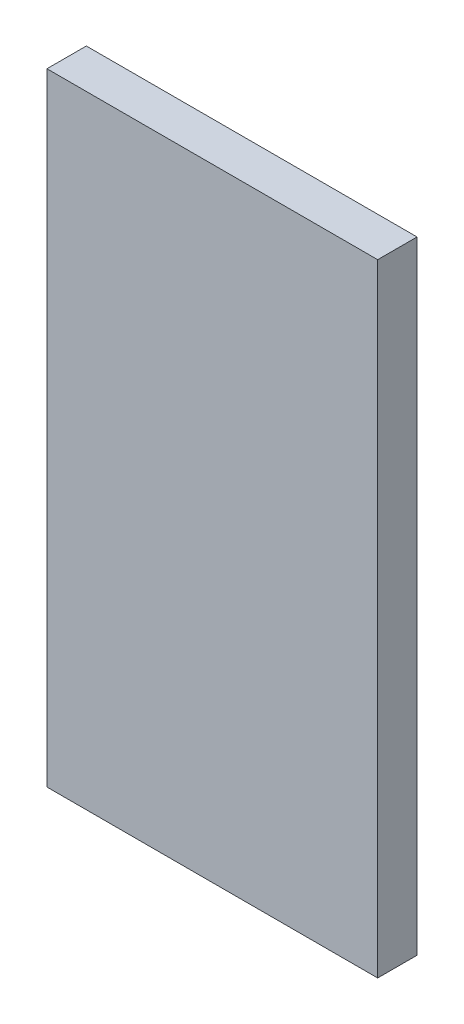
ISO-10303-21;
HEADER;
FILE_DESCRIPTION(('STEP AP214'),'2;1');
FILE_NAME('part.step','',(''),(''),'','','');
FILE_SCHEMA(('AUTOMOTIVE_DESIGN { 1 0 10303 214 1 1 1 1 }'));
ENDSEC;
DATA;
#1=APPLICATION_CONTEXT('core data for automotive mechanical design processes');
#2=APPLICATION_PROTOCOL_DEFINITION('international standard','automotive_design',2000,#1);
#3=PRODUCT_CONTEXT('',#1,'mechanical');
#4=PRODUCT('Part','Part','',(#3));
#5=PRODUCT_RELATED_PRODUCT_CATEGORY('part','',(#4));
#6=PRODUCT_DEFINITION_FORMATION('','',#4);
#7=PRODUCT_DEFINITION_CONTEXT('part definition',#1,'design');
#8=PRODUCT_DEFINITION('design','',#6,#7);
#9=PRODUCT_DEFINITION_SHAPE('','',#8);
#10=(LENGTH_UNIT() NAMED_UNIT(*) SI_UNIT(.MILLI.,.METRE.));
#11=(NAMED_UNIT(*) PLANE_ANGLE_UNIT() SI_UNIT($,.RADIAN.));
#12=(NAMED_UNIT(*) SI_UNIT($,.STERADIAN.) SOLID_ANGLE_UNIT());
#13=UNCERTAINTY_MEASURE_WITH_UNIT(LENGTH_MEASURE(1.E-05),#10,'distance_accuracy_value','');
#14=(GEOMETRIC_REPRESENTATION_CONTEXT(3) GLOBAL_UNCERTAINTY_ASSIGNED_CONTEXT((#13)) GLOBAL_UNIT_ASSIGNED_CONTEXT((#10,
#11,#12)) REPRESENTATION_CONTEXT('',''));
#15=CARTESIAN_POINT('',(0.,0.,0.));
#16=DIRECTION('',(0.,0.,1.));
#17=DIRECTION('',(1.,0.,0.));
#18=AXIS2_PLACEMENT_3D('',#15,#16,#17);
#19=CARTESIAN_POINT('',(42.,-79.,10.));
#20=DIRECTION('',(-1.,0.,0.));
#21=DIRECTION('',(0.,0.,1.));
#22=AXIS2_PLACEMENT_3D('',#19,#20,#21);
#23=PLANE('',#22);
#24=DIRECTION('',(0.,1.,0.));
#25=VECTOR('',#24,1.);
#26=CARTESIAN_POINT('',(42.,-79.,0.));
#27=LINE('',#26,#25);
#28=CARTESIAN_POINT('',(42.,-79.,0.));
#29=VERTEX_POINT('',#28);
#30=CARTESIAN_POINT('',(42.,79.,0.));
#31=VERTEX_POINT('',#30);
#32=EDGE_CURVE('E113',#29,#31,#27,.T.);
#33=ORIENTED_EDGE('',*,*,#32,.T.);
#34=DIRECTION('',(0.,0.,-1.));
#35=VECTOR('',#34,1.);
#36=CARTESIAN_POINT('',(42.,79.,10.));
#37=LINE('',#36,#35);
#38=CARTESIAN_POINT('',(42.,79.,10.));
#39=VERTEX_POINT('',#38);
#40=EDGE_CURVE('E11',#39,#31,#37,.T.);
#41=ORIENTED_EDGE('',*,*,#40,.F.);
#42=DIRECTION('',(0.,1.,0.));
#43=VECTOR('',#42,1.);
#44=CARTESIAN_POINT('',(42.,-79.,10.));
#45=LINE('',#44,#43);
#46=CARTESIAN_POINT('',(42.,-79.,10.));
#47=VERTEX_POINT('',#46);
#48=EDGE_CURVE('E97',#47,#39,#45,.T.);
#49=ORIENTED_EDGE('',*,*,#48,.F.);
#50=DIRECTION('',(0.,0.,-1.));
#51=VECTOR('',#50,1.);
#52=CARTESIAN_POINT('',(42.,-79.,10.));
#53=LINE('',#52,#51);
#54=EDGE_CURVE('E109',#47,#29,#53,.T.);
#55=ORIENTED_EDGE('',*,*,#54,.T.);
#56=EDGE_LOOP('',(#33,#41,#49,#55));
#57=FACE_BOUND('',#56,.T.);
#58=ADVANCED_FACE('F45',(#57),#23,.F.);
#59=CARTESIAN_POINT('',(-42.,79.,10.));
#60=DIRECTION('',(0.,-1.,0.));
#61=DIRECTION('',(0.,0.,-1.));
#62=AXIS2_PLACEMENT_3D('',#59,#60,#61);
#63=PLANE('',#62);
#64=DIRECTION('',(-1.,0.,0.));
#65=VECTOR('',#64,1.);
#66=CARTESIAN_POINT('',(-42.,79.,0.));
#67=LINE('',#66,#65);
#68=CARTESIAN_POINT('',(-42.,79.,0.));
#69=VERTEX_POINT('',#68);
#70=EDGE_CURVE('E102',#31,#69,#67,.T.);
#71=ORIENTED_EDGE('',*,*,#70,.T.);
#72=DIRECTION('',(0.,0.,-1.));
#73=VECTOR('',#72,1.);
#74=CARTESIAN_POINT('',(-42.,79.,10.));
#75=LINE('',#74,#73);
#76=CARTESIAN_POINT('',(-42.,79.,10.));
#77=VERTEX_POINT('',#76);
#78=EDGE_CURVE('E54',#77,#69,#75,.T.);
#79=ORIENTED_EDGE('',*,*,#78,.F.);
#80=DIRECTION('',(-1.,0.,0.));
#81=VECTOR('',#80,1.);
#82=CARTESIAN_POINT('',(-42.,79.,10.));
#83=LINE('',#82,#81);
#84=EDGE_CURVE('E92',#39,#77,#83,.T.);
#85=ORIENTED_EDGE('',*,*,#84,.F.);
#86=ORIENTED_EDGE('',*,*,#40,.T.);
#87=EDGE_LOOP('',(#71,#79,#85,#86));
#88=FACE_BOUND('',#87,.T.);
#89=ADVANCED_FACE('F101',(#88),#63,.F.);
#90=CARTESIAN_POINT('',(-42.,-79.,10.));
#91=DIRECTION('',(1.,0.,0.));
#92=DIRECTION('',(0.,0.,-1.));
#93=AXIS2_PLACEMENT_3D('',#90,#91,#92);
#94=PLANE('',#93);
#95=DIRECTION('',(0.,-1.,0.));
#96=VECTOR('',#95,1.);
#97=CARTESIAN_POINT('',(-42.,-79.,0.));
#98=LINE('',#97,#96);
#99=CARTESIAN_POINT('',(-42.,-79.,0.));
#100=VERTEX_POINT('',#99);
#101=EDGE_CURVE('E79',#69,#100,#98,.T.);
#102=ORIENTED_EDGE('',*,*,#101,.T.);
#103=DIRECTION('',(0.,0.,-1.));
#104=VECTOR('',#103,1.);
#105=CARTESIAN_POINT('',(-42.,-79.,10.));
#106=LINE('',#105,#104);
#107=CARTESIAN_POINT('',(-42.,-79.,10.));
#108=VERTEX_POINT('',#107);
#109=EDGE_CURVE('E104',#108,#100,#106,.T.);
#110=ORIENTED_EDGE('',*,*,#109,.F.);
#111=DIRECTION('',(0.,-1.,0.));
#112=VECTOR('',#111,1.);
#113=CARTESIAN_POINT('',(-42.,-79.,10.));
#114=LINE('',#113,#112);
#115=EDGE_CURVE('E95',#77,#108,#114,.T.);
#116=ORIENTED_EDGE('',*,*,#115,.F.);
#117=ORIENTED_EDGE('',*,*,#78,.T.);
#118=EDGE_LOOP('',(#102,#110,#116,#117));
#119=FACE_BOUND('',#118,.T.);
#120=ADVANCED_FACE('F105',(#119),#94,.F.);
#121=CARTESIAN_POINT('',(-42.,-79.,10.));
#122=DIRECTION('',(0.,1.,0.));
#123=DIRECTION('',(0.,0.,1.));
#124=AXIS2_PLACEMENT_3D('',#121,#122,#123);
#125=PLANE('',#124);
#126=DIRECTION('',(1.,0.,0.));
#127=VECTOR('',#126,1.);
#128=CARTESIAN_POINT('',(-42.,-79.,0.));
#129=LINE('',#128,#127);
#130=EDGE_CURVE('E85',#100,#29,#129,.T.);
#131=ORIENTED_EDGE('',*,*,#130,.T.);
#132=ORIENTED_EDGE('',*,*,#54,.F.);
#133=DIRECTION('',(1.,0.,0.));
#134=VECTOR('',#133,1.);
#135=CARTESIAN_POINT('',(-42.,-79.,10.));
#136=LINE('',#135,#134);
#137=EDGE_CURVE('E62',#108,#47,#136,.T.);
#138=ORIENTED_EDGE('',*,*,#137,.F.);
#139=ORIENTED_EDGE('',*,*,#109,.T.);
#140=EDGE_LOOP('',(#131,#132,#138,#139));
#141=FACE_BOUND('',#140,.T.);
#142=ADVANCED_FACE('F126',(#141),#125,.F.);
#143=CARTESIAN_POINT('',(0.,0.,10.));
#144=DIRECTION('',(0.,0.,-1.));
#145=DIRECTION('',(-1.,0.,0.));
#146=AXIS2_PLACEMENT_3D('',#143,#144,#145);
#147=PLANE('',#146);
#148=ORIENTED_EDGE('',*,*,#48,.T.);
#149=ORIENTED_EDGE('',*,*,#84,.T.);
#150=ORIENTED_EDGE('',*,*,#115,.T.);
#151=ORIENTED_EDGE('',*,*,#137,.T.);
#152=EDGE_LOOP('',(#148,#149,#150,#151));
#153=FACE_BOUND('',#152,.T.);
#154=ADVANCED_FACE('F93',(#153),#147,.F.);
#155=CARTESIAN_POINT('',(0.,0.,0.));
#156=DIRECTION('',(0.,0.,-1.));
#157=DIRECTION('',(-1.,0.,0.));
#158=AXIS2_PLACEMENT_3D('',#155,#156,#157);
#159=PLANE('',#158);
#160=ORIENTED_EDGE('',*,*,#32,.F.);
#161=ORIENTED_EDGE('',*,*,#130,.F.);
#162=ORIENTED_EDGE('',*,*,#101,.F.);
#163=ORIENTED_EDGE('',*,*,#70,.F.);
#164=EDGE_LOOP('',(#160,#161,#162,#163));
#165=FACE_BOUND('',#164,.T.);
#166=ADVANCED_FACE('F129',(#165),#159,.T.);
#167=CLOSED_SHELL('',(#58,#89,#120,#142,#154,#166));
#168=MANIFOLD_SOLID_BREP('B2',#167);
#169=ADVANCED_BREP_SHAPE_REPRESENTATION('',(#18,#168),#14);
#170=SHAPE_DEFINITION_REPRESENTATION(#9,#169);
ENDSEC;
END-ISO-10303-21;
